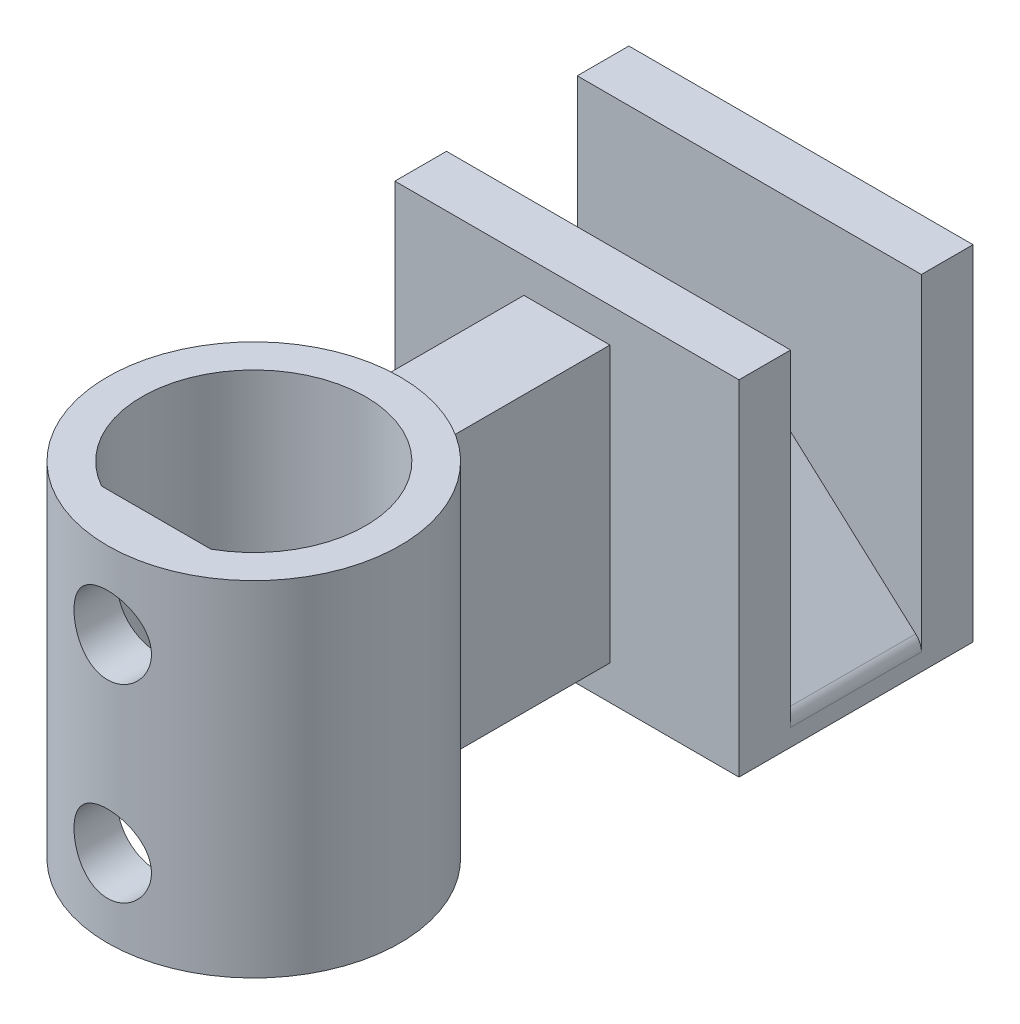
ISO-10303-21;
HEADER;
FILE_DESCRIPTION(('STEP AP214'),'2;1');
FILE_NAME('part.step','',(''),(''),'','','');
FILE_SCHEMA(('AUTOMOTIVE_DESIGN { 1 0 10303 214 1 1 1 1 }'));
ENDSEC;
DATA;
#1=APPLICATION_CONTEXT('core data for automotive mechanical design processes');
#2=APPLICATION_PROTOCOL_DEFINITION('international standard','automotive_design',2000,#1);
#3=PRODUCT_CONTEXT('',#1,'mechanical');
#4=PRODUCT('Part','Part','',(#3));
#5=PRODUCT_RELATED_PRODUCT_CATEGORY('part','',(#4));
#6=PRODUCT_DEFINITION_FORMATION('','',#4);
#7=PRODUCT_DEFINITION_CONTEXT('part definition',#1,'design');
#8=PRODUCT_DEFINITION('design','',#6,#7);
#9=PRODUCT_DEFINITION_SHAPE('','',#8);
#10=(LENGTH_UNIT() NAMED_UNIT(*) SI_UNIT(.MILLI.,.METRE.));
#11=(NAMED_UNIT(*) PLANE_ANGLE_UNIT() SI_UNIT($,.RADIAN.));
#12=(NAMED_UNIT(*) SI_UNIT($,.STERADIAN.) SOLID_ANGLE_UNIT());
#13=UNCERTAINTY_MEASURE_WITH_UNIT(LENGTH_MEASURE(1.E-05),#10,'distance_accuracy_value','');
#14=(GEOMETRIC_REPRESENTATION_CONTEXT(3) GLOBAL_UNCERTAINTY_ASSIGNED_CONTEXT((#13)) GLOBAL_UNIT_ASSIGNED_CONTEXT((#10,
#11,#12)) REPRESENTATION_CONTEXT('',''));
#15=CARTESIAN_POINT('',(0.,0.,0.));
#16=DIRECTION('',(0.,0.,1.));
#17=DIRECTION('',(1.,0.,0.));
#18=AXIS2_PLACEMENT_3D('',#15,#16,#17);
#19=CARTESIAN_POINT('',(0.,39.0416305603426,25.));
#20=DIRECTION('',(0.,-1.,0.));
#21=DIRECTION('',(0.,0.,-1.));
#22=AXIS2_PLACEMENT_3D('',#19,#20,#21);
#23=CYLINDRICAL_SURFACE('',#22,8.5);
#24=CARTESIAN_POINT('',(0.,15.,25.));
#25=DIRECTION('',(0.,-1.,0.));
#26=DIRECTION('',(0.,0.,-1.));
#27=AXIS2_PLACEMENT_3D('',#24,#25,#26);
#28=CIRCLE('',#27,8.5);
#29=CARTESIAN_POINT('',(0.,15.,16.5));
#30=VERTEX_POINT('',#29);
#31=EDGE_CURVE('E188',#30,#30,#28,.T.);
#32=ORIENTED_EDGE('',*,*,#31,.T.);
#33=EDGE_LOOP('',(#32));
#34=FACE_BOUND('',#33,.T.);
#35=CARTESIAN_POINT('',(0.,-5.,25.));
#36=DIRECTION('',(0.,1.,0.));
#37=DIRECTION('',(0.,0.,1.));
#38=AXIS2_PLACEMENT_3D('',#35,#36,#37);
#39=CIRCLE('',#38,8.5);
#40=CARTESIAN_POINT('',(0.,-5.,33.5));
#41=VERTEX_POINT('',#40);
#42=EDGE_CURVE('E194',#41,#41,#39,.F.);
#43=ORIENTED_EDGE('',*,*,#42,.F.);
#44=EDGE_LOOP('',(#43));
#45=FACE_BOUND('',#44,.T.);
#46=CARTESIAN_POINT('',(0.,-3.,25.));
#47=DIRECTION('',(0.,1.,0.));
#48=DIRECTION('',(0.,0.,1.));
#49=AXIS2_PLACEMENT_3D('',#46,#47,#48);
#50=CIRCLE('',#49,8.5);
#51=CARTESIAN_POINT('',(-2.5,-3.,16.875961595364));
#52=VERTEX_POINT('',#51);
#53=CARTESIAN_POINT('',(2.5,-3.,16.875961595364));
#54=VERTEX_POINT('',#53);
#55=EDGE_CURVE('E228',#52,#54,#50,.F.);
#56=ORIENTED_EDGE('',*,*,#55,.T.);
#57=DIRECTION('',(0.,-1.,0.));
#58=VECTOR('',#57,1.);
#59=CARTESIAN_POINT('',(2.49999999999999,39.0416305603426,16.875961595364));
#60=LINE('',#59,#58);
#61=CARTESIAN_POINT('',(2.5,13.,16.875961595364));
#62=VERTEX_POINT('',#61);
#63=EDGE_CURVE('E213',#54,#62,#60,.F.);
#64=ORIENTED_EDGE('',*,*,#63,.T.);
#65=CARTESIAN_POINT('',(0.,13.,25.));
#66=DIRECTION('',(0.,-1.,0.));
#67=DIRECTION('',(0.,0.,-1.));
#68=AXIS2_PLACEMENT_3D('',#65,#66,#67);
#69=CIRCLE('',#68,8.5);
#70=CARTESIAN_POINT('',(-2.5,13.,16.875961595364));
#71=VERTEX_POINT('',#70);
#72=EDGE_CURVE('E235',#62,#71,#69,.F.);
#73=ORIENTED_EDGE('',*,*,#72,.T.);
#74=DIRECTION('',(0.,-1.,0.));
#75=VECTOR('',#74,1.);
#76=CARTESIAN_POINT('',(-2.5,39.0416305603426,16.875961595364));
#77=LINE('',#76,#75);
#78=EDGE_CURVE('E232',#71,#52,#77,.T.);
#79=ORIENTED_EDGE('',*,*,#78,.T.);
#80=EDGE_LOOP('',(#56,#64,#73,#79));
#81=FACE_BOUND('',#80,.T.);
#82=CARTESIAN_POINT('',(-2.25,10.5,33.1967981553775));
#83=CARTESIAN_POINT('',(-2.24999694180408,10.6239840002776,33.1968003362435));
#84=CARTESIAN_POINT('',(-2.23971706610501,10.7480005412109,33.1996419584915));
#85=CARTESIAN_POINT('',(-2.198945615888,10.9924544608563,33.2106680196964));
#86=CARTESIAN_POINT('',(-2.16844370713168,11.112889976629,33.2188551904021));
#87=CARTESIAN_POINT('',(-2.0882990785985,11.3466102401079,33.2395815791112));
#88=CARTESIAN_POINT('',(-2.03868300476042,11.459904688051,33.2521147362105));
#89=CARTESIAN_POINT('',(-1.92180166354043,11.6765786826062,33.2801132198881));
#90=CARTESIAN_POINT('',(-1.85453509902009,11.7799574997535,33.2955787619447));
#91=CARTESIAN_POINT('',(-1.70248951742595,11.9764139017784,33.3281265446091));
#92=CARTESIAN_POINT('',(-1.61735395744878,12.0692109081865,33.3452371126252));
#93=CARTESIAN_POINT('',(-1.4327540142738,12.2393902103004,33.3789023677977));
#94=CARTESIAN_POINT('',(-1.33328816547564,12.3167709274061,33.3954569978831));
#95=CARTESIAN_POINT('',(-1.12090838569079,12.4550884366435,33.4264608929721));
#96=CARTESIAN_POINT('',(-1.00780712819347,12.5157466883929,33.4408728427373));
#97=CARTESIAN_POINT('',(-0.772566710508234,12.6170815196129,33.4656427357432));
#98=CARTESIAN_POINT('',(-0.650429055025734,12.6577614172222,33.4760013521304));
#99=CARTESIAN_POINT('',(-0.403511110172187,12.7170778425828,33.4912971460741));
#100=CARTESIAN_POINT('',(-0.278852839843893,12.7361915561904,33.4963515042717));
#101=CARTESIAN_POINT('',(-0.0280034780646866,12.7533339423421,33.5008788349257));
#102=CARTESIAN_POINT('',(0.0981873570184365,12.7513660941808,33.5003527283806));
#103=CARTESIAN_POINT('',(0.34519977639906,12.7267381177659,33.4938644304373));
#104=CARTESIAN_POINT('',(0.466076857336715,12.7045934898765,33.4880376721779));
#105=CARTESIAN_POINT('',(0.702334013138001,12.6410728615727,33.4717623278363));
#106=CARTESIAN_POINT('',(0.817713776487286,12.5996957727456,33.4613134801802));
#107=CARTESIAN_POINT('',(1.04102215095086,12.4984870248307,33.4367663576623));
#108=CARTESIAN_POINT('',(1.14886634833951,12.4384779194592,33.4226332115479));
#109=CARTESIAN_POINT('',(1.3531303740591,12.301844580475,33.3922415251126));
#110=CARTESIAN_POINT('',(1.44954799839656,12.2252171495074,33.375982576028));
#111=CARTESIAN_POINT('',(1.63129857081783,12.0547825542084,33.342521924539));
#112=CARTESIAN_POINT('',(1.71620777876131,11.9605256731685,33.3253065822884));
#113=CARTESIAN_POINT('',(1.86911637013184,11.7589321307718,33.2923181202052));
#114=CARTESIAN_POINT('',(1.93711475347608,11.6515946964081,33.2765450857034));
#115=CARTESIAN_POINT('',(2.05458778503724,11.4259787352489,33.2481731019722));
#116=CARTESIAN_POINT('',(2.10394886477225,11.3076384369629,33.2355937612802));
#117=CARTESIAN_POINT('',(2.18193716023719,11.0639230764637,33.2152779792318));
#118=CARTESIAN_POINT('',(2.21056943128527,10.9385497375025,33.207540357145));
#119=CARTESIAN_POINT('',(2.24556016825425,10.6882860893502,33.1980351929453));
#120=CARTESIAN_POINT('',(2.25255005779307,10.5634903897575,33.1960984643835));
#121=CARTESIAN_POINT('',(2.24579596911986,10.3145136151024,33.1979517680045));
#122=CARTESIAN_POINT('',(2.23205416085442,10.19033247708,33.2017412008412));
#123=CARTESIAN_POINT('',(2.18478304951454,9.94853203437677,33.2144565867633));
#124=CARTESIAN_POINT('',(2.15163187005439,9.83083314067768,33.2232843058655));
#125=CARTESIAN_POINT('',(2.06690749717098,9.60266578735862,33.2449859622244));
#126=CARTESIAN_POINT('',(2.0153319242454,9.49219826384843,33.2578604220901));
#127=CARTESIAN_POINT('',(1.89393612864426,9.27898360406455,33.2865532711528));
#128=CARTESIAN_POINT('',(1.82374430356199,9.17645600255329,33.3024294781708));
#129=CARTESIAN_POINT('',(1.66757023068808,8.98440278488017,33.3352002454647));
#130=CARTESIAN_POINT('',(1.58158505971235,8.89487958119961,33.3520949938724));
#131=CARTESIAN_POINT('',(1.39334723217788,8.72876291555247,33.3855805923336));
#132=CARTESIAN_POINT('',(1.29070161878611,8.65260935870141,33.4021491503459));
#133=CARTESIAN_POINT('',(1.07371678547403,8.51861464758931,33.4326221761272));
#134=CARTESIAN_POINT('',(0.959378187911347,8.46077251937521,33.4465267855714));
#135=CARTESIAN_POINT('',(0.723057226149525,8.36557056201773,33.470015772103));
#136=CARTESIAN_POINT('',(0.60113959611423,8.32805833034544,33.4796321961789));
#137=CARTESIAN_POINT('',(0.352439036803731,8.2741367860407,33.4936022569498));
#138=CARTESIAN_POINT('',(0.225657174963255,8.25772287044393,33.4979570415506));
#139=CARTESIAN_POINT('',(-0.0250604722587875,8.24674873433714,33.5008598374346));
#140=CARTESIAN_POINT('',(-0.148966409472797,8.2515427679478,33.499579436696));
#141=CARTESIAN_POINT('',(-0.394141954180563,8.28135153536109,33.4917428575153));
#142=CARTESIAN_POINT('',(-0.515411657917084,8.30636552970252,33.4851868720061));
#143=CARTESIAN_POINT('',(-0.751107699159933,8.37554121781611,33.4675689262979));
#144=CARTESIAN_POINT('',(-0.865574416324465,8.41957360028427,33.4565374265752));
#145=CARTESIAN_POINT('',(-1.08556048681217,8.5254205314973,33.4311229382255));
#146=CARTESIAN_POINT('',(-1.19107859706731,8.58723754551755,33.4167394850088));
#147=CARTESIAN_POINT('',(-1.39318530515942,8.72879850578497,33.3856885458129));
#148=CARTESIAN_POINT('',(-1.48946543719377,8.80897181418192,33.3689708718519));
#149=CARTESIAN_POINT('',(-1.66742398064291,8.98415288335479,33.3353414220771));
#150=CARTESIAN_POINT('',(-1.74909856114583,9.07916452389294,33.3184295965731));
#151=CARTESIAN_POINT('',(-1.8972708258445,9.2837921479421,33.285906991571));
#152=CARTESIAN_POINT('',(-1.96340296292341,9.39367904330234,33.2703321637851));
#153=CARTESIAN_POINT('',(-2.07615948784757,9.62341015894324,33.2427515934587));
#154=CARTESIAN_POINT('',(-2.12279681152532,9.74324771294936,33.2307434857482));
#155=CARTESIAN_POINT('',(-2.18903256232817,9.96889360228065,33.2133487458215));
#156=CARTESIAN_POINT('',(-2.21184214669942,10.0737109686333,33.2071920574266));
#157=CARTESIAN_POINT('',(-2.24232635318084,10.2856776239988,33.1989160421293));
#158=CARTESIAN_POINT('',(-2.25000264354342,10.3928266546586,33.1967962702092));
#159=CARTESIAN_POINT('',(-2.25,10.5,33.1967981553775));
#160=B_SPLINE_CURVE_WITH_KNOTS('',3,(#82,#83,#84,#85,#86,#87,#88,#89,#90,#91,#92,#93,#94,#95,
#96,#97,#98,#99,#100,#101,#102,#103,#104,#105,#106,#107,#108,#109,#110,#111,#112,#113,#114,#115,
#116,#117,#118,#119,#120,#121,#122,#123,#124,#125,#126,#127,#128,#129,#130,#131,#132,#133,#134,
#135,#136,#137,#138,#139,#140,#141,#142,#143,#144,#145,#146,#147,#148,#149,#150,#151,#152,#153,
#154,#155,#156,#157,#158,#159),.UNSPECIFIED.,.T.,.F.,(4,2,2,2,2,2,2,2,2,2,2,2,2,2,2,2,2,2,2,2,2,
2,2,2,2,2,2,2,2,2,2,2,2,2,2,2,2,2,4),(0.,0.37155797163531,0.743305970231715,1.11453760110695,
1.48579652152091,1.86532086241599,2.24488404596034,2.63043245150024,3.01591680090743,
3.39269333716487,3.76940769129443,4.13675920765004,4.50413151587257,4.87511584526133,
5.24617161521628,5.62845622010334,6.01076342740043,6.3953640456007,6.77987083621654,
7.15304843134813,7.52618696941451,7.89228731518204,8.25843495975225,8.63252754907452,
9.00668944894658,9.39148781847044,9.77626571779774,10.1581177737158,10.539886507824,
10.9101123860205,11.2803247253535,11.6480585642679,12.0158434024024,12.3933170752266,
12.7708896114263,13.156610044578,13.5420741241071,13.8632889681006,14.1844684002793),.UNSPECIFIED.);
#161=CARTESIAN_POINT('',(-2.25,10.5,33.1967981553775));
#162=VERTEX_POINT('',#161);
#163=EDGE_CURVE('E200',#162,#162,#160,.T.);
#164=ORIENTED_EDGE('',*,*,#163,.T.);
#165=EDGE_LOOP('',(#164));
#166=FACE_BOUND('',#165,.T.);
#167=CARTESIAN_POINT('',(-2.25,-0.500000000000002,33.1967981553775));
#168=CARTESIAN_POINT('',(-2.24999694180408,-0.376015999722374,33.1968003362435));
#169=CARTESIAN_POINT('',(-2.23971706610501,-0.251999458789078,33.1996419584915));
#170=CARTESIAN_POINT('',(-2.198945615888,-0.00754553914369019,33.2106680196964));
#171=CARTESIAN_POINT('',(-2.16844370713168,0.112889976628972,33.2188551904021));
#172=CARTESIAN_POINT('',(-2.0882990785985,0.346610240107896,33.2395815791112));
#173=CARTESIAN_POINT('',(-2.03868300476042,0.459904688051024,33.2521147362105));
#174=CARTESIAN_POINT('',(-1.92180166354043,0.676578682606188,33.2801132198881));
#175=CARTESIAN_POINT('',(-1.85453509902009,0.779957499753548,33.2955787619447));
#176=CARTESIAN_POINT('',(-1.70248951742595,0.976413901778359,33.3281265446091));
#177=CARTESIAN_POINT('',(-1.61735395744878,1.06921090818649,33.3452371126252));
#178=CARTESIAN_POINT('',(-1.4327540142738,1.23939021030035,33.3789023677977));
#179=CARTESIAN_POINT('',(-1.33328816547564,1.31677092740614,33.3954569978831));
#180=CARTESIAN_POINT('',(-1.12090838569079,1.45508843664353,33.426460892972));
#181=CARTESIAN_POINT('',(-1.00780712819347,1.51574668839292,33.4408728427372));
#182=CARTESIAN_POINT('',(-0.772566710508234,1.6170815196129,33.4656427357431));
#183=CARTESIAN_POINT('',(-0.650429055025735,1.65776141722221,33.4760013521304));
#184=CARTESIAN_POINT('',(-0.403511110172187,1.71707784258281,33.4912971460741));
#185=CARTESIAN_POINT('',(-0.278852839843893,1.73619155619042,33.4963515042717));
#186=CARTESIAN_POINT('',(-0.0280034780646869,1.75333394234214,33.5008788349257));
#187=CARTESIAN_POINT('',(0.0981873570184361,1.75136609418084,33.5003527283806));
#188=CARTESIAN_POINT('',(0.34519977639906,1.72673811776592,33.4938644304373));
#189=CARTESIAN_POINT('',(0.466076857336715,1.70459348987647,33.4880376721779));
#190=CARTESIAN_POINT('',(0.702334013138001,1.6410728615727,33.4717623278363));
#191=CARTESIAN_POINT('',(0.817713776487285,1.59969577274563,33.4613134801802));
#192=CARTESIAN_POINT('',(1.04102215095086,1.49848702483075,33.4367663576623));
#193=CARTESIAN_POINT('',(1.14886634833951,1.43847791945919,33.4226332115479));
#194=CARTESIAN_POINT('',(1.3531303740591,1.30184458047502,33.3922415251126));
#195=CARTESIAN_POINT('',(1.44954799839656,1.22521714950741,33.375982576028));
#196=CARTESIAN_POINT('',(1.63129857081783,1.05478255420836,33.342521924539));
#197=CARTESIAN_POINT('',(1.71620777876131,0.960525673168511,33.3253065822884));
#198=CARTESIAN_POINT('',(1.86911637013183,0.758932130771777,33.2923181202052));
#199=CARTESIAN_POINT('',(1.93711475347608,0.651594696408099,33.2765450857034));
#200=CARTESIAN_POINT('',(2.05458778503724,0.425978735248875,33.2481731019722));
#201=CARTESIAN_POINT('',(2.10394886477225,0.307638436962872,33.2355937612802));
#202=CARTESIAN_POINT('',(2.18193716023719,0.0639230764637289,33.2152779792318));
#203=CARTESIAN_POINT('',(2.21056943128527,-0.0614502624975041,33.207540357145));
#204=CARTESIAN_POINT('',(2.24556016825425,-0.311713910649751,33.1980351929453));
#205=CARTESIAN_POINT('',(2.25255005779307,-0.436509610242537,33.1960984643835));
#206=CARTESIAN_POINT('',(2.24579596911986,-0.685486384897617,33.1979517680045));
#207=CARTESIAN_POINT('',(2.23205416085442,-0.809667522920008,33.2017412008412));
#208=CARTESIAN_POINT('',(2.18478304951454,-1.05146796562323,33.2144565867633));
#209=CARTESIAN_POINT('',(2.15163187005439,-1.16916685932232,33.2232843058654));
#210=CARTESIAN_POINT('',(2.06690749717098,-1.39733421264138,33.2449859622244));
#211=CARTESIAN_POINT('',(2.0153319242454,-1.50780173615157,33.2578604220901));
#212=CARTESIAN_POINT('',(1.89393612864426,-1.72101639593545,33.2865532711528));
#213=CARTESIAN_POINT('',(1.82374430356199,-1.82354399744671,33.3024294781708));
#214=CARTESIAN_POINT('',(1.66757023068808,-2.01559721511983,33.3352002454647));
#215=CARTESIAN_POINT('',(1.58158505971235,-2.10512041880039,33.3520949938724));
#216=CARTESIAN_POINT('',(1.39334723217788,-2.27123708444753,33.3855805923336));
#217=CARTESIAN_POINT('',(1.29070161878611,-2.34739064129859,33.4021491503459));
#218=CARTESIAN_POINT('',(1.07371678547403,-2.48138535241069,33.4326221761272));
#219=CARTESIAN_POINT('',(0.959378187911347,-2.53922748062479,33.4465267855714));
#220=CARTESIAN_POINT('',(0.723057226149525,-2.63442943798227,33.470015772103));
#221=CARTESIAN_POINT('',(0.60113959611423,-2.67194166965456,33.4796321961789));
#222=CARTESIAN_POINT('',(0.352439036803731,-2.7258632139593,33.4936022569498));
#223=CARTESIAN_POINT('',(0.225657174963256,-2.74227712955607,33.4979570415506));
#224=CARTESIAN_POINT('',(-0.0250604722587871,-2.75325126566286,33.5008598374346));
#225=CARTESIAN_POINT('',(-0.148966409472797,-2.7484572320522,33.499579436696));
#226=CARTESIAN_POINT('',(-0.394141954180563,-2.71864846463891,33.4917428575153));
#227=CARTESIAN_POINT('',(-0.515411657917083,-2.69363447029748,33.4851868720061));
#228=CARTESIAN_POINT('',(-0.751107699159933,-2.62445878218389,33.4675689262979));
#229=CARTESIAN_POINT('',(-0.865574416324465,-2.58042639971573,33.4565374265752));
#230=CARTESIAN_POINT('',(-1.08556048681217,-2.4745794685027,33.4311229382255));
#231=CARTESIAN_POINT('',(-1.19107859706731,-2.41276245448245,33.4167394850088));
#232=CARTESIAN_POINT('',(-1.39318530515942,-2.27120149421503,33.3856885458129));
#233=CARTESIAN_POINT('',(-1.48946543719377,-2.19102818581808,33.3689708718519));
#234=CARTESIAN_POINT('',(-1.66742398064291,-2.01584711664521,33.3353414220771));
#235=CARTESIAN_POINT('',(-1.74909856114582,-1.92083547610706,33.3184295965731));
#236=CARTESIAN_POINT('',(-1.8972708258445,-1.7162078520579,33.285906991571));
#237=CARTESIAN_POINT('',(-1.96340296292341,-1.60632095669767,33.2703321637851));
#238=CARTESIAN_POINT('',(-2.07615948784757,-1.37658984105676,33.2427515934587));
#239=CARTESIAN_POINT('',(-2.12279681152532,-1.25675228705065,33.2307434857482));
#240=CARTESIAN_POINT('',(-2.18903256232817,-1.03110639771935,33.2133487458215));
#241=CARTESIAN_POINT('',(-2.21184214669942,-0.92628903136672,33.2071920574266));
#242=CARTESIAN_POINT('',(-2.24232635318084,-0.714322376001232,33.1989160421293));
#243=CARTESIAN_POINT('',(-2.25000264354342,-0.607173345341352,33.1967962702092));
#244=CARTESIAN_POINT('',(-2.25,-0.500000000000002,33.1967981553775));
#245=B_SPLINE_CURVE_WITH_KNOTS('',3,(#167,#168,#169,#170,#171,#172,#173,#174,#175,#176,#177,
#178,#179,#180,#181,#182,#183,#184,#185,#186,#187,#188,#189,#190,#191,#192,#193,#194,#195,#196,
#197,#198,#199,#200,#201,#202,#203,#204,#205,#206,#207,#208,#209,#210,#211,#212,#213,#214,#215,
#216,#217,#218,#219,#220,#221,#222,#223,#224,#225,#226,#227,#228,#229,#230,#231,#232,#233,#234,
#235,#236,#237,#238,#239,#240,#241,#242,#243,#244),.UNSPECIFIED.,.T.,.F.,(4,2,2,2,2,2,2,2,2,2,2,
2,2,2,2,2,2,2,2,2,2,2,2,2,2,2,2,2,2,2,2,2,2,2,2,2,2,2,4),(0.,0.371557971635309,
0.743305970231715,1.11453760110695,1.48579652152091,1.86532086241599,2.24488404596033,
2.63043245150024,3.01591680090743,3.39269333716487,3.76940769129443,4.13675920765004,
4.50413151587256,4.87511584526133,5.24617161521628,5.62845622010334,6.01076342740043,
6.3953640456007,6.77987083621654,7.15304843134812,7.5261869694145,7.89228731518204,
8.25843495975225,8.63252754907452,9.00668944894658,9.39148781847044,9.77626571779773,
10.1581177737158,10.539886507824,10.9101123860205,11.2803247253535,11.6480585642679,
12.0158434024024,12.3933170752266,12.7708896114263,13.156610044578,13.5420741241071,
13.8632889681006,14.1844684002793),.UNSPECIFIED.);
#246=CARTESIAN_POINT('',(-2.25,-0.500000000000002,33.1967981553775));
#247=VERTEX_POINT('',#246);
#248=EDGE_CURVE('E618',#247,#247,#245,.T.);
#249=ORIENTED_EDGE('',*,*,#248,.T.);
#250=EDGE_LOOP('',(#249));
#251=FACE_BOUND('',#250,.T.);
#252=ADVANCED_FACE('F37',(#34,#45,#81,#166,#251),#23,.T.);
#253=CARTESIAN_POINT('',(0.,0.,6.8));
#254=DIRECTION('',(0.,0.,1.));
#255=DIRECTION('',(1.,0.,0.));
#256=AXIS2_PLACEMENT_3D('',#253,#254,#255);
#257=PLANE('',#256);
#258=DIRECTION('',(0.,1.,0.));
#259=VECTOR('',#258,1.);
#260=CARTESIAN_POINT('',(10.,15.,6.8));
#261=LINE('',#260,#259);
#262=CARTESIAN_POINT('',(10.,-5.,6.8));
#263=VERTEX_POINT('',#262);
#264=CARTESIAN_POINT('',(10.,15.,6.8));
#265=VERTEX_POINT('',#264);
#266=EDGE_CURVE('E265',#263,#265,#261,.T.);
#267=ORIENTED_EDGE('',*,*,#266,.T.);
#268=DIRECTION('',(-1.,0.,0.));
#269=VECTOR('',#268,1.);
#270=CARTESIAN_POINT('',(-10.,15.,6.8));
#271=LINE('',#270,#269);
#272=CARTESIAN_POINT('',(-10.,15.,6.8));
#273=VERTEX_POINT('',#272);
#274=EDGE_CURVE('E268',#265,#273,#271,.T.);
#275=ORIENTED_EDGE('',*,*,#274,.T.);
#276=DIRECTION('',(0.,-1.,0.));
#277=VECTOR('',#276,1.);
#278=CARTESIAN_POINT('',(-10.,15.,6.8));
#279=LINE('',#278,#277);
#280=CARTESIAN_POINT('',(-10.,-5.,6.8));
#281=VERTEX_POINT('',#280);
#282=EDGE_CURVE('E271',#273,#281,#279,.T.);
#283=ORIENTED_EDGE('',*,*,#282,.T.);
#284=DIRECTION('',(1.,0.,0.));
#285=VECTOR('',#284,1.);
#286=CARTESIAN_POINT('',(-10.,-5.,6.8));
#287=LINE('',#286,#285);
#288=EDGE_CURVE('E274',#281,#263,#287,.T.);
#289=ORIENTED_EDGE('',*,*,#288,.T.);
#290=EDGE_LOOP('',(#267,#275,#283,#289));
#291=FACE_BOUND('',#290,.T.);
#292=DIRECTION('',(-1.,0.,0.));
#293=VECTOR('',#292,1.);
#294=CARTESIAN_POINT('',(-2.5,13.,6.8));
#295=LINE('',#294,#293);
#296=CARTESIAN_POINT('',(2.5,13.,6.8));
#297=VERTEX_POINT('',#296);
#298=CARTESIAN_POINT('',(-2.5,13.,6.8));
#299=VERTEX_POINT('',#298);
#300=EDGE_CURVE('E217',#297,#299,#295,.T.);
#301=ORIENTED_EDGE('',*,*,#300,.F.);
#302=DIRECTION('',(0.,1.,0.));
#303=VECTOR('',#302,1.);
#304=CARTESIAN_POINT('',(2.5,13.,6.8));
#305=LINE('',#304,#303);
#306=CARTESIAN_POINT('',(2.5,-3.,6.8));
#307=VERTEX_POINT('',#306);
#308=EDGE_CURVE('E221',#307,#297,#305,.T.);
#309=ORIENTED_EDGE('',*,*,#308,.F.);
#310=DIRECTION('',(1.,0.,0.));
#311=VECTOR('',#310,1.);
#312=CARTESIAN_POINT('',(-2.5,-3.,6.8));
#313=LINE('',#312,#311);
#314=CARTESIAN_POINT('',(-2.5,-3.,6.8));
#315=VERTEX_POINT('',#314);
#316=EDGE_CURVE('E210',#315,#307,#313,.T.);
#317=ORIENTED_EDGE('',*,*,#316,.F.);
#318=DIRECTION('',(0.,-1.,0.));
#319=VECTOR('',#318,1.);
#320=CARTESIAN_POINT('',(-2.5,13.,6.8));
#321=LINE('',#320,#319);
#322=EDGE_CURVE('E54',#299,#315,#321,.T.);
#323=ORIENTED_EDGE('',*,*,#322,.F.);
#324=EDGE_LOOP('',(#301,#309,#317,#323));
#325=FACE_BOUND('',#324,.T.);
#326=ADVANCED_FACE('F398',(#291,#325),#257,.T.);
#327=CARTESIAN_POINT('',(10.,-5.,3.8));
#328=DIRECTION('',(-1.,0.,0.));
#329=DIRECTION('',(0.,0.,1.));
#330=AXIS2_PLACEMENT_3D('',#327,#328,#329);
#331=PLANE('',#330);
#332=DIRECTION('',(0.,0.,-1.));
#333=VECTOR('',#332,1.);
#334=CARTESIAN_POINT('',(10.,-5.,3.8));
#335=LINE('',#334,#333);
#336=CARTESIAN_POINT('',(10.,-5.,-6.8));
#337=VERTEX_POINT('',#336);
#338=EDGE_CURVE('E292',#263,#337,#335,.T.);
#339=ORIENTED_EDGE('',*,*,#338,.T.);
#340=DIRECTION('',(0.,1.,0.));
#341=VECTOR('',#340,1.);
#342=CARTESIAN_POINT('',(10.,15.,-6.8));
#343=LINE('',#342,#341);
#344=CARTESIAN_POINT('',(10.,15.,-6.8));
#345=VERTEX_POINT('',#344);
#346=EDGE_CURVE('E240',#337,#345,#343,.T.);
#347=ORIENTED_EDGE('',*,*,#346,.T.);
#348=DIRECTION('',(0.,0.,1.));
#349=VECTOR('',#348,1.);
#350=CARTESIAN_POINT('',(10.,15.,-6.8));
#351=LINE('',#350,#349);
#352=CARTESIAN_POINT('',(10.,15.,-3.8));
#353=VERTEX_POINT('',#352);
#354=EDGE_CURVE('E253',#345,#353,#351,.T.);
#355=ORIENTED_EDGE('',*,*,#354,.T.);
#356=DIRECTION('',(0.,1.,0.));
#357=VECTOR('',#356,1.);
#358=CARTESIAN_POINT('',(10.,15.,-3.8));
#359=LINE('',#358,#357);
#360=CARTESIAN_POINT('',(10.,-3.99906710613801,-3.8));
#361=VERTEX_POINT('',#360);
#362=EDGE_CURVE('E231',#361,#353,#359,.T.);
#363=ORIENTED_EDGE('',*,*,#362,.F.);
#364=DIRECTION('',(0.,0.,-1.));
#365=VECTOR('',#364,1.);
#366=CARTESIAN_POINT('',(10.,-3.99906710613801,3.8));
#367=LINE('',#366,#365);
#368=CARTESIAN_POINT('',(10.,-3.99906710613801,3.8));
#369=VERTEX_POINT('',#368);
#370=EDGE_CURVE('E338',#361,#369,#367,.F.);
#371=ORIENTED_EDGE('',*,*,#370,.T.);
#372=DIRECTION('',(0.,1.,0.));
#373=VECTOR('',#372,1.);
#374=CARTESIAN_POINT('',(10.,15.,3.8));
#375=LINE('',#374,#373);
#376=CARTESIAN_POINT('',(10.,15.,3.8));
#377=VERTEX_POINT('',#376);
#378=EDGE_CURVE('E264',#369,#377,#375,.T.);
#379=ORIENTED_EDGE('',*,*,#378,.T.);
#380=DIRECTION('',(0.,0.,-1.));
#381=VECTOR('',#380,1.);
#382=CARTESIAN_POINT('',(10.,15.,6.8));
#383=LINE('',#382,#381);
#384=EDGE_CURVE('E285',#265,#377,#383,.T.);
#385=ORIENTED_EDGE('',*,*,#384,.F.);
#386=ORIENTED_EDGE('',*,*,#266,.F.);
#387=EDGE_LOOP('',(#339,#347,#355,#363,#371,#379,#385,#386));
#388=FACE_BOUND('',#387,.T.);
#389=ADVANCED_FACE('F376',(#388),#331,.F.);
#390=CARTESIAN_POINT('',(-10.,5.,3.8));
#391=DIRECTION('',(0.,-1.,0.));
#392=DIRECTION('',(0.,0.,-1.));
#393=AXIS2_PLACEMENT_3D('',#390,#391,#392);
#394=PLANE('',#393);
#395=DIRECTION('',(-1.,0.,0.));
#396=VECTOR('',#395,1.);
#397=CARTESIAN_POINT('',(-10.,5.,3.8));
#398=LINE('',#397,#396);
#399=CARTESIAN_POINT('',(0.116135964964554,5.,3.8));
#400=VERTEX_POINT('',#399);
#401=CARTESIAN_POINT('',(-0.116135964964551,5.,3.8));
#402=VERTEX_POINT('',#401);
#403=EDGE_CURVE('E289',#400,#402,#398,.T.);
#404=ORIENTED_EDGE('',*,*,#403,.F.);
#405=DIRECTION('',(0.,0.,1.));
#406=VECTOR('',#405,1.);
#407=CARTESIAN_POINT('',(0.116135964964554,5.,-3.8));
#408=LINE('',#407,#406);
#409=CARTESIAN_POINT('',(0.116135964964554,5.,-3.8));
#410=VERTEX_POINT('',#409);
#411=EDGE_CURVE('E11',#400,#410,#408,.F.);
#412=ORIENTED_EDGE('',*,*,#411,.T.);
#413=DIRECTION('',(-1.,0.,0.));
#414=VECTOR('',#413,1.);
#415=CARTESIAN_POINT('',(-10.,5.,-3.8));
#416=LINE('',#415,#414);
#417=CARTESIAN_POINT('',(-0.116135964964551,5.,-3.8));
#418=VERTEX_POINT('',#417);
#419=EDGE_CURVE('E288',#410,#418,#416,.T.);
#420=ORIENTED_EDGE('',*,*,#419,.T.);
#421=DIRECTION('',(0.,0.,-1.));
#422=VECTOR('',#421,1.);
#423=CARTESIAN_POINT('',(-0.116135964964551,5.,3.8));
#424=LINE('',#423,#422);
#425=EDGE_CURVE('E46',#418,#402,#424,.F.);
#426=ORIENTED_EDGE('',*,*,#425,.T.);
#427=EDGE_LOOP('',(#404,#412,#420,#426));
#428=FACE_BOUND('',#427,.T.);
#429=ADVANCED_FACE('F346',(#428),#394,.F.);
#430=CARTESIAN_POINT('',(-10.,-5.,3.8));
#431=DIRECTION('',(1.,0.,0.));
#432=DIRECTION('',(0.,0.,-1.));
#433=AXIS2_PLACEMENT_3D('',#430,#431,#432);
#434=PLANE('',#433);
#435=DIRECTION('',(0.,0.,-1.));
#436=VECTOR('',#435,1.);
#437=CARTESIAN_POINT('',(-10.,-5.,3.8));
#438=LINE('',#437,#436);
#439=CARTESIAN_POINT('',(-10.,-5.,-6.8));
#440=VERTEX_POINT('',#439);
#441=EDGE_CURVE('E295',#281,#440,#438,.T.);
#442=ORIENTED_EDGE('',*,*,#441,.F.);
#443=ORIENTED_EDGE('',*,*,#282,.F.);
#444=DIRECTION('',(0.,0.,-1.));
#445=VECTOR('',#444,1.);
#446=CARTESIAN_POINT('',(-10.,15.,6.8));
#447=LINE('',#446,#445);
#448=CARTESIAN_POINT('',(-10.,15.,3.8));
#449=VERTEX_POINT('',#448);
#450=EDGE_CURVE('E277',#273,#449,#447,.T.);
#451=ORIENTED_EDGE('',*,*,#450,.T.);
#452=DIRECTION('',(0.,-1.,0.));
#453=VECTOR('',#452,1.);
#454=CARTESIAN_POINT('',(-10.,15.,3.8));
#455=LINE('',#454,#453);
#456=CARTESIAN_POINT('',(-10.,-3.99906710613802,3.8));
#457=VERTEX_POINT('',#456);
#458=EDGE_CURVE('E269',#449,#457,#455,.T.);
#459=ORIENTED_EDGE('',*,*,#458,.T.);
#460=DIRECTION('',(0.,0.,1.));
#461=VECTOR('',#460,1.);
#462=CARTESIAN_POINT('',(-10.,-3.99906710613802,-3.8));
#463=LINE('',#462,#461);
#464=CARTESIAN_POINT('',(-10.,-3.99906710613802,-3.8));
#465=VERTEX_POINT('',#464);
#466=EDGE_CURVE('E309',#457,#465,#463,.F.);
#467=ORIENTED_EDGE('',*,*,#466,.T.);
#468=DIRECTION('',(0.,-1.,0.));
#469=VECTOR('',#468,1.);
#470=CARTESIAN_POINT('',(-10.,15.,-3.8));
#471=LINE('',#470,#469);
#472=CARTESIAN_POINT('',(-10.,15.,-3.8));
#473=VERTEX_POINT('',#472);
#474=EDGE_CURVE('E255',#473,#465,#471,.T.);
#475=ORIENTED_EDGE('',*,*,#474,.F.);
#476=DIRECTION('',(0.,0.,1.));
#477=VECTOR('',#476,1.);
#478=CARTESIAN_POINT('',(-10.,15.,-6.8));
#479=LINE('',#478,#477);
#480=CARTESIAN_POINT('',(-10.,15.,-6.8));
#481=VERTEX_POINT('',#480);
#482=EDGE_CURVE('E262',#481,#473,#479,.T.);
#483=ORIENTED_EDGE('',*,*,#482,.F.);
#484=DIRECTION('',(0.,-1.,0.));
#485=VECTOR('',#484,1.);
#486=CARTESIAN_POINT('',(-10.,15.,-6.8));
#487=LINE('',#486,#485);
#488=EDGE_CURVE('E247',#481,#440,#487,.T.);
#489=ORIENTED_EDGE('',*,*,#488,.T.);
#490=EDGE_LOOP('',(#442,#443,#451,#459,#467,#475,#483,#489));
#491=FACE_BOUND('',#490,.T.);
#492=ADVANCED_FACE('F367',(#491),#434,.F.);
#493=CARTESIAN_POINT('',(-10.,-5.,3.8));
#494=DIRECTION('',(0.,1.,0.));
#495=DIRECTION('',(0.,0.,1.));
#496=AXIS2_PLACEMENT_3D('',#493,#494,#495);
#497=PLANE('',#496);
#498=ORIENTED_EDGE('',*,*,#441,.T.);
#499=DIRECTION('',(1.,0.,0.));
#500=VECTOR('',#499,1.);
#501=CARTESIAN_POINT('',(-10.,-5.,-6.8));
#502=LINE('',#501,#500);
#503=EDGE_CURVE('E243',#440,#337,#502,.T.);
#504=ORIENTED_EDGE('',*,*,#503,.T.);
#505=ORIENTED_EDGE('',*,*,#338,.F.);
#506=ORIENTED_EDGE('',*,*,#288,.F.);
#507=EDGE_LOOP('',(#498,#504,#505,#506));
#508=FACE_BOUND('',#507,.T.);
#509=ADVANCED_FACE('F386',(#508),#497,.F.);
#510=CARTESIAN_POINT('',(0.499999999999967,5.,3.8));
#511=DIRECTION('',(-0.669130606358857,-0.743144825477396,0.));
#512=DIRECTION('',(0.,0.,-1.));
#513=AXIS2_PLACEMENT_3D('',#510,#511,#512);
#514=PLANE('',#513);
#515=DIRECTION('',(0.743144825477396,-0.669130606358857,0.));
#516=VECTOR('',#515,1.);
#517=CARTESIAN_POINT('',(0.499999999999967,5.,3.8));
#518=LINE('',#517,#516);
#519=CARTESIAN_POINT('',(9.66913060635886,-3.25592228066062,3.8));
#520=VERTEX_POINT('',#519);
#521=CARTESIAN_POINT('',(0.78526657132341,4.7431448254774,3.8));
#522=VERTEX_POINT('',#521);
#523=EDGE_CURVE('E306',#520,#522,#518,.F.);
#524=ORIENTED_EDGE('',*,*,#523,.F.);
#525=DIRECTION('',(0.,0.,1.));
#526=VECTOR('',#525,1.);
#527=CARTESIAN_POINT('',(9.66913060635886,-3.25592228066062,-3.8));
#528=LINE('',#527,#526);
#529=CARTESIAN_POINT('',(9.66913060635886,-3.25592228066062,-3.8));
#530=VERTEX_POINT('',#529);
#531=EDGE_CURVE('E343',#520,#530,#528,.F.);
#532=ORIENTED_EDGE('',*,*,#531,.T.);
#533=DIRECTION('',(-0.743144825477396,0.669130606358857,0.));
#534=VECTOR('',#533,1.);
#535=CARTESIAN_POINT('',(2.71017262260375,3.0099516320112,-3.8));
#536=LINE('',#535,#534);
#537=CARTESIAN_POINT('',(0.78526657132341,4.7431448254774,-3.8));
#538=VERTEX_POINT('',#537);
#539=EDGE_CURVE('E300',#538,#530,#536,.F.);
#540=ORIENTED_EDGE('',*,*,#539,.F.);
#541=DIRECTION('',(0.,0.,-1.));
#542=VECTOR('',#541,1.);
#543=CARTESIAN_POINT('',(0.78526657132341,4.7431448254774,3.8));
#544=LINE('',#543,#542);
#545=EDGE_CURVE('E341',#538,#522,#544,.F.);
#546=ORIENTED_EDGE('',*,*,#545,.T.);
#547=EDGE_LOOP('',(#524,#532,#540,#546));
#548=FACE_BOUND('',#547,.T.);
#549=ADVANCED_FACE('F384',(#548),#514,.F.);
#550=CARTESIAN_POINT('',(-10.,-3.55383842082948,3.8));
#551=DIRECTION('',(0.669130606358857,-0.743144825477395,0.));
#552=DIRECTION('',(0.,0.,-1.));
#553=AXIS2_PLACEMENT_3D('',#550,#551,#552);
#554=PLANE('',#553);
#555=DIRECTION('',(-0.743144825477395,-0.669130606358857,0.));
#556=VECTOR('',#555,1.);
#557=CARTESIAN_POINT('',(-2.71017262260375,3.00995163201119,-3.8));
#558=LINE('',#557,#556);
#559=CARTESIAN_POINT('',(-9.66913060635886,-3.25592228066062,-3.8));
#560=VERTEX_POINT('',#559);
#561=CARTESIAN_POINT('',(-0.785266571323408,4.7431448254774,-3.8));
#562=VERTEX_POINT('',#561);
#563=EDGE_CURVE('E297',#560,#562,#558,.F.);
#564=ORIENTED_EDGE('',*,*,#563,.F.);
#565=DIRECTION('',(0.,0.,-1.));
#566=VECTOR('',#565,1.);
#567=CARTESIAN_POINT('',(-9.66913060635886,-3.25592228066062,3.8));
#568=LINE('',#567,#566);
#569=CARTESIAN_POINT('',(-9.66913060635886,-3.25592228066062,3.8));
#570=VERTEX_POINT('',#569);
#571=EDGE_CURVE('E326',#560,#570,#568,.F.);
#572=ORIENTED_EDGE('',*,*,#571,.T.);
#573=DIRECTION('',(0.743144825477395,0.669130606358857,0.));
#574=VECTOR('',#573,1.);
#575=CARTESIAN_POINT('',(-10.,-3.55383842082948,3.8));
#576=LINE('',#575,#574);
#577=CARTESIAN_POINT('',(-0.785266571323408,4.74314482547739,3.8));
#578=VERTEX_POINT('',#577);
#579=EDGE_CURVE('E303',#578,#570,#576,.F.);
#580=ORIENTED_EDGE('',*,*,#579,.F.);
#581=DIRECTION('',(0.,0.,1.));
#582=VECTOR('',#581,1.);
#583=CARTESIAN_POINT('',(-0.785266571323408,4.7431448254774,-3.8));
#584=LINE('',#583,#582);
#585=EDGE_CURVE('E324',#578,#562,#584,.F.);
#586=ORIENTED_EDGE('',*,*,#585,.T.);
#587=EDGE_LOOP('',(#564,#572,#580,#586));
#588=FACE_BOUND('',#587,.T.);
#589=ADVANCED_FACE('F360',(#588),#554,.F.);
#590=CARTESIAN_POINT('',(-9.,-3.99906710613802,3.8));
#591=DIRECTION('',(0.,0.,-1.));
#592=DIRECTION('',(-1.,0.,0.));
#593=AXIS2_PLACEMENT_3D('',#590,#591,#592);
#594=CYLINDRICAL_SURFACE('',#593,1.);
#595=CARTESIAN_POINT('',(-9.,-3.99906710613802,3.8));
#596=DIRECTION('',(0.,0.,-1.));
#597=DIRECTION('',(-1.,0.,0.));
#598=AXIS2_PLACEMENT_3D('',#595,#596,#597);
#599=CIRCLE('',#598,1.);
#600=EDGE_CURVE('E335',#570,#457,#599,.F.);
#601=ORIENTED_EDGE('',*,*,#600,.F.);
#602=ORIENTED_EDGE('',*,*,#571,.F.);
#603=CARTESIAN_POINT('',(-9.,-3.99906710613802,-3.8));
#604=DIRECTION('',(0.,0.,-1.));
#605=DIRECTION('',(-1.,0.,0.));
#606=AXIS2_PLACEMENT_3D('',#603,#604,#605);
#607=CIRCLE('',#606,1.);
#608=EDGE_CURVE('E321',#465,#560,#607,.T.);
#609=ORIENTED_EDGE('',*,*,#608,.F.);
#610=ORIENTED_EDGE('',*,*,#466,.F.);
#611=EDGE_LOOP('',(#601,#602,#609,#610));
#612=FACE_BOUND('',#611,.T.);
#613=ADVANCED_FACE('F392',(#612),#594,.T.);
#614=CARTESIAN_POINT('',(9.00000000000001,-3.99906710613801,3.8));
#615=DIRECTION('',(0.,0.,1.));
#616=DIRECTION('',(1.,0.,0.));
#617=AXIS2_PLACEMENT_3D('',#614,#615,#616);
#618=CYLINDRICAL_SURFACE('',#617,1.);
#619=CARTESIAN_POINT('',(9.00000000000001,-3.99906710613801,-3.8));
#620=DIRECTION('',(0.,0.,-1.));
#621=DIRECTION('',(-1.,0.,0.));
#622=AXIS2_PLACEMENT_3D('',#619,#620,#621);
#623=CIRCLE('',#622,1.);
#624=EDGE_CURVE('E318',#530,#361,#623,.T.);
#625=ORIENTED_EDGE('',*,*,#624,.F.);
#626=ORIENTED_EDGE('',*,*,#531,.F.);
#627=CARTESIAN_POINT('',(9.00000000000001,-3.99906710613801,3.8));
#628=DIRECTION('',(0.,0.,-1.));
#629=DIRECTION('',(-1.,0.,0.));
#630=AXIS2_PLACEMENT_3D('',#627,#628,#629);
#631=CIRCLE('',#630,1.);
#632=EDGE_CURVE('E332',#369,#520,#631,.F.);
#633=ORIENTED_EDGE('',*,*,#632,.F.);
#634=ORIENTED_EDGE('',*,*,#370,.F.);
#635=EDGE_LOOP('',(#625,#626,#633,#634));
#636=FACE_BOUND('',#635,.T.);
#637=ADVANCED_FACE('F381',(#636),#618,.T.);
#638=CARTESIAN_POINT('',(0.116135964964554,4.,3.8));
#639=DIRECTION('',(0.,0.,-1.));
#640=DIRECTION('',(-1.,0.,0.));
#641=AXIS2_PLACEMENT_3D('',#638,#639,#640);
#642=CYLINDRICAL_SURFACE('',#641,1.);
#643=CARTESIAN_POINT('',(0.116135964964554,4.,3.8));
#644=DIRECTION('',(0.,0.,-1.));
#645=DIRECTION('',(-1.,0.,0.));
#646=AXIS2_PLACEMENT_3D('',#643,#644,#645);
#647=CIRCLE('',#646,1.);
#648=EDGE_CURVE('E329',#522,#400,#647,.F.);
#649=ORIENTED_EDGE('',*,*,#648,.F.);
#650=ORIENTED_EDGE('',*,*,#545,.F.);
#651=CARTESIAN_POINT('',(0.116135964964554,4.,-3.8));
#652=DIRECTION('',(0.,0.,-1.));
#653=DIRECTION('',(-1.,0.,0.));
#654=AXIS2_PLACEMENT_3D('',#651,#652,#653);
#655=CIRCLE('',#654,1.);
#656=EDGE_CURVE('E315',#410,#538,#655,.T.);
#657=ORIENTED_EDGE('',*,*,#656,.F.);
#658=ORIENTED_EDGE('',*,*,#411,.F.);
#659=EDGE_LOOP('',(#649,#650,#657,#658));
#660=FACE_BOUND('',#659,.T.);
#661=ADVANCED_FACE('F355',(#660),#642,.T.);
#662=CARTESIAN_POINT('',(-0.116135964964551,4.,3.8));
#663=DIRECTION('',(0.,0.,1.));
#664=DIRECTION('',(1.,0.,0.));
#665=AXIS2_PLACEMENT_3D('',#662,#663,#664);
#666=CYLINDRICAL_SURFACE('',#665,1.);
#667=CARTESIAN_POINT('',(-0.116135964964551,4.,-3.8));
#668=DIRECTION('',(0.,0.,-1.));
#669=DIRECTION('',(-1.,0.,0.));
#670=AXIS2_PLACEMENT_3D('',#667,#668,#669);
#671=CIRCLE('',#670,1.);
#672=EDGE_CURVE('E312',#562,#418,#671,.T.);
#673=ORIENTED_EDGE('',*,*,#672,.F.);
#674=ORIENTED_EDGE('',*,*,#585,.F.);
#675=CARTESIAN_POINT('',(-0.116135964964551,4.,3.8));
#676=DIRECTION('',(0.,0.,-1.));
#677=DIRECTION('',(-1.,0.,0.));
#678=AXIS2_PLACEMENT_3D('',#675,#676,#677);
#679=CIRCLE('',#678,1.);
#680=EDGE_CURVE('E62',#402,#578,#679,.F.);
#681=ORIENTED_EDGE('',*,*,#680,.F.);
#682=ORIENTED_EDGE('',*,*,#425,.F.);
#683=EDGE_LOOP('',(#673,#674,#681,#682));
#684=FACE_BOUND('',#683,.T.);
#685=ADVANCED_FACE('F39',(#684),#666,.T.);
#686=CARTESIAN_POINT('',(-10.,15.,6.8));
#687=DIRECTION('',(0.,-1.,0.));
#688=DIRECTION('',(0.,0.,-1.));
#689=AXIS2_PLACEMENT_3D('',#686,#687,#688);
#690=PLANE('',#689);
#691=DIRECTION('',(-1.,0.,0.));
#692=VECTOR('',#691,1.);
#693=CARTESIAN_POINT('',(-10.,15.,3.8));
#694=LINE('',#693,#692);
#695=EDGE_CURVE('E279',#377,#449,#694,.T.);
#696=ORIENTED_EDGE('',*,*,#695,.T.);
#697=ORIENTED_EDGE('',*,*,#450,.F.);
#698=ORIENTED_EDGE('',*,*,#274,.F.);
#699=ORIENTED_EDGE('',*,*,#384,.T.);
#700=EDGE_LOOP('',(#696,#697,#698,#699));
#701=FACE_BOUND('',#700,.T.);
#702=ADVANCED_FACE('F372',(#701),#690,.F.);
#703=CARTESIAN_POINT('',(0.,0.,3.8));
#704=DIRECTION('',(0.,0.,1.));
#705=DIRECTION('',(1.,0.,0.));
#706=AXIS2_PLACEMENT_3D('',#703,#704,#705);
#707=PLANE('',#706);
#708=ORIENTED_EDGE('',*,*,#579,.T.);
#709=ORIENTED_EDGE('',*,*,#600,.T.);
#710=ORIENTED_EDGE('',*,*,#458,.F.);
#711=ORIENTED_EDGE('',*,*,#695,.F.);
#712=ORIENTED_EDGE('',*,*,#378,.F.);
#713=ORIENTED_EDGE('',*,*,#632,.T.);
#714=ORIENTED_EDGE('',*,*,#523,.T.);
#715=ORIENTED_EDGE('',*,*,#648,.T.);
#716=ORIENTED_EDGE('',*,*,#403,.T.);
#717=ORIENTED_EDGE('',*,*,#680,.T.);
#718=EDGE_LOOP('',(#708,#709,#710,#711,#712,#713,#714,#715,#716,#717));
#719=FACE_BOUND('',#718,.T.);
#720=ADVANCED_FACE('F351',(#719),#707,.F.);
#721=CARTESIAN_POINT('',(-10.,15.,-6.8));
#722=DIRECTION('',(0.,1.,0.));
#723=DIRECTION('',(0.,0.,1.));
#724=AXIS2_PLACEMENT_3D('',#721,#722,#723);
#725=PLANE('',#724);
#726=DIRECTION('',(-1.,0.,0.));
#727=VECTOR('',#726,1.);
#728=CARTESIAN_POINT('',(-10.,15.,-3.8));
#729=LINE('',#728,#727);
#730=EDGE_CURVE('E244',#353,#473,#729,.T.);
#731=ORIENTED_EDGE('',*,*,#730,.F.);
#732=ORIENTED_EDGE('',*,*,#354,.F.);
#733=DIRECTION('',(-1.,0.,0.));
#734=VECTOR('',#733,1.);
#735=CARTESIAN_POINT('',(-10.,15.,-6.8));
#736=LINE('',#735,#734);
#737=EDGE_CURVE('E250',#345,#481,#736,.T.);
#738=ORIENTED_EDGE('',*,*,#737,.T.);
#739=ORIENTED_EDGE('',*,*,#482,.T.);
#740=EDGE_LOOP('',(#731,#732,#738,#739));
#741=FACE_BOUND('',#740,.T.);
#742=ADVANCED_FACE('F437',(#741),#725,.T.);
#743=CARTESIAN_POINT('',(0.,0.,-6.8));
#744=DIRECTION('',(0.,0.,-1.));
#745=DIRECTION('',(1.,0.,0.));
#746=AXIS2_PLACEMENT_3D('',#743,#744,#745);
#747=PLANE('',#746);
#748=ORIENTED_EDGE('',*,*,#346,.F.);
#749=ORIENTED_EDGE('',*,*,#503,.F.);
#750=ORIENTED_EDGE('',*,*,#488,.F.);
#751=ORIENTED_EDGE('',*,*,#737,.F.);
#752=EDGE_LOOP('',(#748,#749,#750,#751));
#753=FACE_BOUND('',#752,.T.);
#754=ADVANCED_FACE('F434',(#753),#747,.T.);
#755=CARTESIAN_POINT('',(0.,0.,-3.8));
#756=DIRECTION('',(0.,0.,-1.));
#757=DIRECTION('',(1.,0.,0.));
#758=AXIS2_PLACEMENT_3D('',#755,#756,#757);
#759=PLANE('',#758);
#760=ORIENTED_EDGE('',*,*,#474,.T.);
#761=ORIENTED_EDGE('',*,*,#608,.T.);
#762=ORIENTED_EDGE('',*,*,#563,.T.);
#763=ORIENTED_EDGE('',*,*,#672,.T.);
#764=ORIENTED_EDGE('',*,*,#419,.F.);
#765=ORIENTED_EDGE('',*,*,#656,.T.);
#766=ORIENTED_EDGE('',*,*,#539,.T.);
#767=ORIENTED_EDGE('',*,*,#624,.T.);
#768=ORIENTED_EDGE('',*,*,#362,.T.);
#769=ORIENTED_EDGE('',*,*,#730,.T.);
#770=EDGE_LOOP('',(#760,#761,#762,#763,#764,#765,#766,#767,#768,#769));
#771=FACE_BOUND('',#770,.T.);
#772=ADVANCED_FACE('F357',(#771),#759,.F.);
#773=CARTESIAN_POINT('',(2.5,13.,33.501));
#774=DIRECTION('',(-1.,0.,0.));
#775=DIRECTION('',(0.,-1.,0.));
#776=AXIS2_PLACEMENT_3D('',#773,#774,#775);
#777=PLANE('',#776);
#778=ORIENTED_EDGE('',*,*,#63,.F.);
#779=DIRECTION('',(0.,0.,-1.));
#780=VECTOR('',#779,1.);
#781=CARTESIAN_POINT('',(2.5,-3.,33.501));
#782=LINE('',#781,#780);
#783=EDGE_CURVE('E206',#54,#307,#782,.T.);
#784=ORIENTED_EDGE('',*,*,#783,.T.);
#785=ORIENTED_EDGE('',*,*,#308,.T.);
#786=DIRECTION('',(0.,0.,-1.));
#787=VECTOR('',#786,1.);
#788=CARTESIAN_POINT('',(2.5,13.,33.501));
#789=LINE('',#788,#787);
#790=EDGE_CURVE('E220',#62,#297,#789,.T.);
#791=ORIENTED_EDGE('',*,*,#790,.F.);
#792=EDGE_LOOP('',(#778,#784,#785,#791));
#793=FACE_BOUND('',#792,.T.);
#794=ADVANCED_FACE('F420',(#793),#777,.F.);
#795=CARTESIAN_POINT('',(-2.5,13.,33.501));
#796=DIRECTION('',(0.,-1.,0.));
#797=DIRECTION('',(0.,0.,-1.));
#798=AXIS2_PLACEMENT_3D('',#795,#796,#797);
#799=PLANE('',#798);
#800=ORIENTED_EDGE('',*,*,#72,.F.);
#801=ORIENTED_EDGE('',*,*,#790,.T.);
#802=ORIENTED_EDGE('',*,*,#300,.T.);
#803=DIRECTION('',(0.,0.,-1.));
#804=VECTOR('',#803,1.);
#805=CARTESIAN_POINT('',(-2.5,13.,33.501));
#806=LINE('',#805,#804);
#807=EDGE_CURVE('E216',#71,#299,#806,.T.);
#808=ORIENTED_EDGE('',*,*,#807,.F.);
#809=EDGE_LOOP('',(#800,#801,#802,#808));
#810=FACE_BOUND('',#809,.T.);
#811=ADVANCED_FACE('F423',(#810),#799,.F.);
#812=CARTESIAN_POINT('',(-2.5,13.,33.501));
#813=DIRECTION('',(1.,0.,0.));
#814=DIRECTION('',(0.,1.,0.));
#815=AXIS2_PLACEMENT_3D('',#812,#813,#814);
#816=PLANE('',#815);
#817=ORIENTED_EDGE('',*,*,#78,.F.);
#818=ORIENTED_EDGE('',*,*,#807,.T.);
#819=ORIENTED_EDGE('',*,*,#322,.T.);
#820=DIRECTION('',(0.,0.,-1.));
#821=VECTOR('',#820,1.);
#822=CARTESIAN_POINT('',(-2.5,-3.,33.501));
#823=LINE('',#822,#821);
#824=EDGE_CURVE('E214',#52,#315,#823,.T.);
#825=ORIENTED_EDGE('',*,*,#824,.F.);
#826=EDGE_LOOP('',(#817,#818,#819,#825));
#827=FACE_BOUND('',#826,.T.);
#828=ADVANCED_FACE('F427',(#827),#816,.F.);
#829=CARTESIAN_POINT('',(-2.5,-3.,33.501));
#830=DIRECTION('',(0.,1.,0.));
#831=DIRECTION('',(0.,0.,1.));
#832=AXIS2_PLACEMENT_3D('',#829,#830,#831);
#833=PLANE('',#832);
#834=ORIENTED_EDGE('',*,*,#55,.F.);
#835=ORIENTED_EDGE('',*,*,#824,.T.);
#836=ORIENTED_EDGE('',*,*,#316,.T.);
#837=ORIENTED_EDGE('',*,*,#783,.F.);
#838=EDGE_LOOP('',(#834,#835,#836,#837));
#839=FACE_BOUND('',#838,.T.);
#840=ADVANCED_FACE('F416',(#839),#833,.F.);
#841=CARTESIAN_POINT('',(0.,39.0416305603426,25.));
#842=DIRECTION('',(0.,-1.,0.));
#843=DIRECTION('',(0.,0.,-1.));
#844=AXIS2_PLACEMENT_3D('',#841,#842,#843);
#845=CYLINDRICAL_SURFACE('',#844,6.5);
#846=CARTESIAN_POINT('',(0.,15.,25.));
#847=DIRECTION('',(0.,-1.,0.));
#848=DIRECTION('',(0.,0.,-1.));
#849=AXIS2_PLACEMENT_3D('',#846,#847,#848);
#850=CIRCLE('',#849,6.5);
#851=CARTESIAN_POINT('',(-3.175,15.,30.6718052681664));
#852=VERTEX_POINT('',#851);
#853=CARTESIAN_POINT('',(3.175,15.,30.6718052681664));
#854=VERTEX_POINT('',#853);
#855=EDGE_CURVE('E183',#852,#854,#850,.T.);
#856=ORIENTED_EDGE('',*,*,#855,.F.);
#857=DIRECTION('',(0.,-1.,0.));
#858=VECTOR('',#857,1.);
#859=CARTESIAN_POINT('',(-3.175,39.0416305603426,30.6718052681664));
#860=LINE('',#859,#858);
#861=CARTESIAN_POINT('',(-3.175,-5.,30.6718052681664));
#862=VERTEX_POINT('',#861);
#863=EDGE_CURVE('E178',#852,#862,#860,.T.);
#864=ORIENTED_EDGE('',*,*,#863,.T.);
#865=CARTESIAN_POINT('',(0.,-5.,25.));
#866=DIRECTION('',(0.,1.,0.));
#867=DIRECTION('',(0.,0.,1.));
#868=AXIS2_PLACEMENT_3D('',#865,#866,#867);
#869=CIRCLE('',#868,6.5);
#870=CARTESIAN_POINT('',(3.175,-5.,30.6718052681664));
#871=VERTEX_POINT('',#870);
#872=EDGE_CURVE('E182',#862,#871,#869,.F.);
#873=ORIENTED_EDGE('',*,*,#872,.T.);
#874=DIRECTION('',(0.,-1.,0.));
#875=VECTOR('',#874,1.);
#876=CARTESIAN_POINT('',(3.175,39.0416305603426,30.6718052681664));
#877=LINE('',#876,#875);
#878=EDGE_CURVE('E187',#854,#871,#877,.T.);
#879=ORIENTED_EDGE('',*,*,#878,.F.);
#880=EDGE_LOOP('',(#856,#864,#873,#879));
#881=FACE_BOUND('',#880,.T.);
#882=ADVANCED_FACE('F180',(#881),#845,.F.);
#883=CARTESIAN_POINT('',(3.175,39.0416305603426,30.6718052681664));
#884=DIRECTION('',(0.,0.,-1.));
#885=DIRECTION('',(-1.,0.,0.));
#886=AXIS2_PLACEMENT_3D('',#883,#884,#885);
#887=PLANE('',#886);
#888=CARTESIAN_POINT('',(0.,-0.500000000000002,30.6718052681664));
#889=DIRECTION('',(0.,0.,-1.));
#890=DIRECTION('',(-1.,0.,0.));
#891=AXIS2_PLACEMENT_3D('',#888,#889,#890);
#892=CIRCLE('',#891,2.25);
#893=CARTESIAN_POINT('',(-2.25,-0.500000000000002,30.6718052681664));
#894=VERTEX_POINT('',#893);
#895=EDGE_CURVE('E41',#894,#894,#892,.F.);
#896=ORIENTED_EDGE('',*,*,#895,.T.);
#897=EDGE_LOOP('',(#896));
#898=FACE_BOUND('',#897,.T.);
#899=CARTESIAN_POINT('',(0.,10.5,30.6718052681664));
#900=DIRECTION('',(0.,0.,-1.));
#901=DIRECTION('',(-1.,0.,0.));
#902=AXIS2_PLACEMENT_3D('',#899,#900,#901);
#903=CIRCLE('',#902,2.25);
#904=CARTESIAN_POINT('',(-2.25,10.5,30.6718052681664));
#905=VERTEX_POINT('',#904);
#906=EDGE_CURVE('E197',#905,#905,#903,.F.);
#907=ORIENTED_EDGE('',*,*,#906,.T.);
#908=EDGE_LOOP('',(#907));
#909=FACE_BOUND('',#908,.T.);
#910=DIRECTION('',(-1.,0.,0.));
#911=VECTOR('',#910,1.);
#912=CARTESIAN_POINT('',(3.175,15.,30.6718052681664));
#913=LINE('',#912,#911);
#914=EDGE_CURVE('E205',#854,#852,#913,.T.);
#915=ORIENTED_EDGE('',*,*,#914,.F.);
#916=ORIENTED_EDGE('',*,*,#878,.T.);
#917=DIRECTION('',(-1.,0.,0.));
#918=VECTOR('',#917,1.);
#919=CARTESIAN_POINT('',(3.175,-5.,30.6718052681664));
#920=LINE('',#919,#918);
#921=EDGE_CURVE('E193',#871,#862,#920,.T.);
#922=ORIENTED_EDGE('',*,*,#921,.T.);
#923=ORIENTED_EDGE('',*,*,#863,.F.);
#924=EDGE_LOOP('',(#915,#916,#922,#923));
#925=FACE_BOUND('',#924,.T.);
#926=ADVANCED_FACE('F196',(#898,#909,#925),#887,.T.);
#927=CARTESIAN_POINT('',(-10.,15.,6.8));
#928=DIRECTION('',(0.,-1.,0.));
#929=DIRECTION('',(0.,0.,-1.));
#930=AXIS2_PLACEMENT_3D('',#927,#928,#929);
#931=PLANE('',#930);
#932=ORIENTED_EDGE('',*,*,#855,.T.);
#933=ORIENTED_EDGE('',*,*,#914,.T.);
#934=EDGE_LOOP('',(#932,#933));
#935=FACE_BOUND('',#934,.T.);
#936=ORIENTED_EDGE('',*,*,#31,.F.);
#937=EDGE_LOOP('',(#936));
#938=FACE_BOUND('',#937,.T.);
#939=ADVANCED_FACE('F412',(#935,#938),#931,.F.);
#940=CARTESIAN_POINT('',(-10.,-5.,3.8));
#941=DIRECTION('',(0.,1.,0.));
#942=DIRECTION('',(0.,0.,1.));
#943=AXIS2_PLACEMENT_3D('',#940,#941,#942);
#944=PLANE('',#943);
#945=ORIENTED_EDGE('',*,*,#42,.T.);
#946=EDGE_LOOP('',(#945));
#947=FACE_BOUND('',#946,.T.);
#948=ORIENTED_EDGE('',*,*,#921,.F.);
#949=ORIENTED_EDGE('',*,*,#872,.F.);
#950=EDGE_LOOP('',(#948,#949));
#951=FACE_BOUND('',#950,.T.);
#952=ADVANCED_FACE('F192',(#947,#951),#944,.F.);
#953=CARTESIAN_POINT('',(0.,10.5,33.501));
#954=DIRECTION('',(0.,0.,-1.));
#955=DIRECTION('',(-1.,0.,0.));
#956=AXIS2_PLACEMENT_3D('',#953,#954,#955);
#957=CYLINDRICAL_SURFACE('',#956,2.25);
#958=ORIENTED_EDGE('',*,*,#906,.F.);
#959=EDGE_LOOP('',(#958));
#960=FACE_BOUND('',#959,.T.);
#961=ORIENTED_EDGE('',*,*,#163,.F.);
#962=EDGE_LOOP('',(#961));
#963=FACE_BOUND('',#962,.T.);
#964=ADVANCED_FACE('F580',(#960,#963),#957,.F.);
#965=CARTESIAN_POINT('',(0.,-0.500000000000002,33.501));
#966=DIRECTION('',(0.,0.,-1.));
#967=DIRECTION('',(-1.,0.,0.));
#968=AXIS2_PLACEMENT_3D('',#965,#966,#967);
#969=CYLINDRICAL_SURFACE('',#968,2.25);
#970=ORIENTED_EDGE('',*,*,#895,.F.);
#971=EDGE_LOOP('',(#970));
#972=FACE_BOUND('',#971,.T.);
#973=ORIENTED_EDGE('',*,*,#248,.F.);
#974=EDGE_LOOP('',(#973));
#975=FACE_BOUND('',#974,.T.);
#976=ADVANCED_FACE('F598',(#972,#975),#969,.F.);
#977=CLOSED_SHELL('',(#252,#326,#389,#429,#492,#509,#549,#589,#613,#637,#661,#685,#702,#720,
#742,#754,#772,#794,#811,#828,#840,#882,#926,#939,#952,#964,#976));
#978=MANIFOLD_SOLID_BREP('B2',#977);
#979=ADVANCED_BREP_SHAPE_REPRESENTATION('',(#18,#978),#14);
#980=SHAPE_DEFINITION_REPRESENTATION(#9,#979);
ENDSEC;
END-ISO-10303-21;
